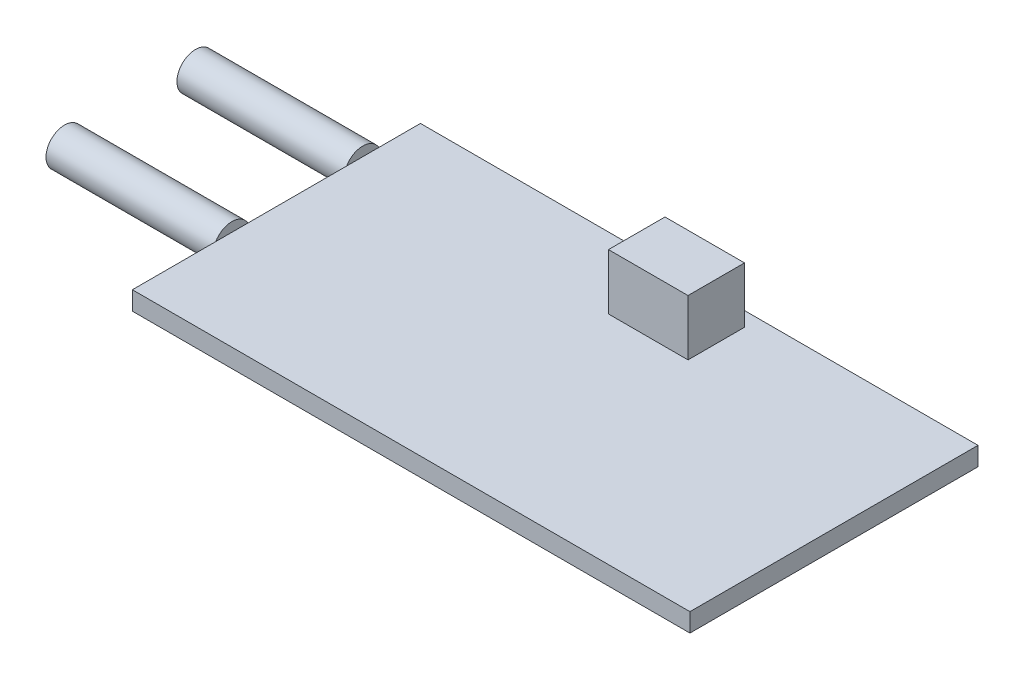
ISO-10303-21;
HEADER;
FILE_DESCRIPTION(('STEP AP214'),'2;1');
FILE_NAME('part.step','',(''),(''),'','','');
FILE_SCHEMA(('AUTOMOTIVE_DESIGN { 1 0 10303 214 1 1 1 1 }'));
ENDSEC;
DATA;
#1=APPLICATION_CONTEXT('core data for automotive mechanical design processes');
#2=APPLICATION_PROTOCOL_DEFINITION('international standard','automotive_design',2000,#1);
#3=PRODUCT_CONTEXT('',#1,'mechanical');
#4=PRODUCT('Part','Part','',(#3));
#5=PRODUCT_RELATED_PRODUCT_CATEGORY('part','',(#4));
#6=PRODUCT_DEFINITION_FORMATION('','',#4);
#7=PRODUCT_DEFINITION_CONTEXT('part definition',#1,'design');
#8=PRODUCT_DEFINITION('design','',#6,#7);
#9=PRODUCT_DEFINITION_SHAPE('','',#8);
#10=(LENGTH_UNIT() NAMED_UNIT(*) SI_UNIT(.MILLI.,.METRE.));
#11=(NAMED_UNIT(*) PLANE_ANGLE_UNIT() SI_UNIT($,.RADIAN.));
#12=(NAMED_UNIT(*) SI_UNIT($,.STERADIAN.) SOLID_ANGLE_UNIT());
#13=UNCERTAINTY_MEASURE_WITH_UNIT(LENGTH_MEASURE(1.E-05),#10,'distance_accuracy_value','');
#14=(GEOMETRIC_REPRESENTATION_CONTEXT(3) GLOBAL_UNCERTAINTY_ASSIGNED_CONTEXT((#13)) GLOBAL_UNIT_ASSIGNED_CONTEXT((#10,
#11,#12)) REPRESENTATION_CONTEXT('',''));
#15=CARTESIAN_POINT('',(0.,0.,0.));
#16=DIRECTION('',(0.,0.,1.));
#17=DIRECTION('',(1.,0.,0.));
#18=AXIS2_PLACEMENT_3D('',#15,#16,#17);
#19=CARTESIAN_POINT('',(0.,1.,0.));
#20=DIRECTION('',(0.,1.,0.));
#21=DIRECTION('',(0.,0.,1.));
#22=AXIS2_PLACEMENT_3D('',#19,#20,#21);
#23=PLANE('',#22);
#24=DIRECTION('',(0.,0.,1.));
#25=VECTOR('',#24,1.);
#26=CARTESIAN_POINT('',(-13.2565925385268,1.,-3.82128101443198));
#27=LINE('',#26,#25);
#28=CARTESIAN_POINT('',(-13.2565925385268,1.,-3.82128101443198));
#29=VERTEX_POINT('',#28);
#30=CARTESIAN_POINT('',(-13.2565925385268,1.,-1.58380192241857));
#31=VERTEX_POINT('',#30);
#32=EDGE_CURVE('E172',#29,#31,#27,.T.);
#33=ORIENTED_EDGE('',*,*,#32,.T.);
#34=CARTESIAN_POINT('',(-13.2565925385268,1.,0.148248885150303));
#35=VERTEX_POINT('',#34);
#36=EDGE_CURVE('E176',#31,#35,#27,.T.);
#37=ORIENTED_EDGE('',*,*,#36,.T.);
#38=CARTESIAN_POINT('',(-13.2565925385268,1.,5.46048365552543));
#39=VERTEX_POINT('',#38);
#40=EDGE_CURVE('E221',#35,#39,#27,.T.);
#41=ORIENTED_EDGE('',*,*,#40,.T.);
#42=DIRECTION('',(0.,0.,1.));
#43=VECTOR('',#42,1.);
#44=CARTESIAN_POINT('',(-13.2565925385268,1.,0.));
#45=LINE('',#44,#43);
#46=CARTESIAN_POINT('',(-13.2565925385268,1.,7.19253446309431));
#47=VERTEX_POINT('',#46);
#48=EDGE_CURVE('E161',#39,#47,#45,.T.);
#49=ORIENTED_EDGE('',*,*,#48,.T.);
#50=CARTESIAN_POINT('',(-13.2565925385268,1.,11.678718985568));
#51=VERTEX_POINT('',#50);
#52=EDGE_CURVE('E58',#47,#51,#27,.T.);
#53=ORIENTED_EDGE('',*,*,#52,.T.);
#54=DIRECTION('',(1.,0.,0.));
#55=VECTOR('',#54,1.);
#56=CARTESIAN_POINT('',(-13.2565925385268,1.,11.678718985568));
#57=LINE('',#56,#55);
#58=CARTESIAN_POINT('',(16.7434074614732,1.,11.678718985568));
#59=VERTEX_POINT('',#58);
#60=EDGE_CURVE('E175',#51,#59,#57,.T.);
#61=ORIENTED_EDGE('',*,*,#60,.T.);
#62=DIRECTION('',(0.,0.,-1.));
#63=VECTOR('',#62,1.);
#64=CARTESIAN_POINT('',(16.7434074614732,1.,-3.82128101443198));
#65=LINE('',#64,#63);
#66=CARTESIAN_POINT('',(16.7434074614732,1.,-3.82128101443198));
#67=VERTEX_POINT('',#66);
#68=EDGE_CURVE('E178',#59,#67,#65,.T.);
#69=ORIENTED_EDGE('',*,*,#68,.T.);
#70=DIRECTION('',(-1.,0.,0.));
#71=VECTOR('',#70,1.);
#72=CARTESIAN_POINT('',(-13.2565925385268,1.,-3.82128101443198));
#73=LINE('',#72,#71);
#74=EDGE_CURVE('E180',#67,#29,#73,.T.);
#75=ORIENTED_EDGE('',*,*,#74,.T.);
#76=EDGE_LOOP('',(#33,#37,#41,#49,#53,#61,#69,#75));
#77=FACE_BOUND('',#76,.T.);
#78=DIRECTION('',(1.,0.,0.));
#79=VECTOR('',#78,1.);
#80=CARTESIAN_POINT('',(0.681732786404154,1.,0.));
#81=LINE('',#80,#79);
#82=CARTESIAN_POINT('',(0.681732786404154,1.,0.));
#83=VERTEX_POINT('',#82);
#84=CARTESIAN_POINT('',(4.96113015813648,1.,0.));
#85=VERTEX_POINT('',#84);
#86=EDGE_CURVE('E433',#83,#85,#81,.T.);
#87=ORIENTED_EDGE('',*,*,#86,.F.);
#88=DIRECTION('',(0.,0.,1.));
#89=VECTOR('',#88,1.);
#90=CARTESIAN_POINT('',(0.681732786404154,1.,-3.04077300840788));
#91=LINE('',#90,#89);
#92=CARTESIAN_POINT('',(0.681732786404154,1.,-3.04077300840788));
#93=VERTEX_POINT('',#92);
#94=EDGE_CURVE('E148',#93,#83,#91,.T.);
#95=ORIENTED_EDGE('',*,*,#94,.F.);
#96=DIRECTION('',(-1.,0.,0.));
#97=VECTOR('',#96,1.);
#98=CARTESIAN_POINT('',(0.681732786404154,1.,-3.04077300840788));
#99=LINE('',#98,#97);
#100=CARTESIAN_POINT('',(4.96113015813648,1.,-3.04077300840788));
#101=VERTEX_POINT('',#100);
#102=EDGE_CURVE('E144',#101,#93,#99,.T.);
#103=ORIENTED_EDGE('',*,*,#102,.F.);
#104=DIRECTION('',(0.,0.,-1.));
#105=VECTOR('',#104,1.);
#106=CARTESIAN_POINT('',(4.96113015813648,1.,-3.04077300840788));
#107=LINE('',#106,#105);
#108=EDGE_CURVE('E430',#85,#101,#107,.T.);
#109=ORIENTED_EDGE('',*,*,#108,.F.);
#110=EDGE_LOOP('',(#87,#95,#103,#109));
#111=FACE_BOUND('',#110,.T.);
#112=ADVANCED_FACE('F32',(#77,#111),#23,.T.);
#113=CARTESIAN_POINT('',(-13.2565925385268,1.,-3.82128101443198));
#114=DIRECTION('',(1.,0.,0.));
#115=DIRECTION('',(0.,0.,-1.));
#116=AXIS2_PLACEMENT_3D('',#113,#114,#115);
#117=PLANE('',#116);
#118=CARTESIAN_POINT('',(-13.2565925385268,0.5,6.32650905930987));
#119=DIRECTION('',(-1.,0.,0.));
#120=DIRECTION('',(0.,0.,1.));
#121=AXIS2_PLACEMENT_3D('',#118,#119,#120);
#122=CIRCLE('',#121,1.);
#123=CARTESIAN_POINT('',(-13.2565925385268,0.,7.19253446309431));
#124=VERTEX_POINT('',#123);
#125=EDGE_CURVE('E150',#124,#47,#122,.T.);
#126=ORIENTED_EDGE('',*,*,#125,.F.);
#127=DIRECTION('',(0.,0.,1.));
#128=VECTOR('',#127,1.);
#129=CARTESIAN_POINT('',(-13.2565925385268,0.,-3.82128101443198));
#130=LINE('',#129,#128);
#131=CARTESIAN_POINT('',(-13.2565925385268,0.,11.678718985568));
#132=VERTEX_POINT('',#131);
#133=EDGE_CURVE('E168',#124,#132,#130,.T.);
#134=ORIENTED_EDGE('',*,*,#133,.T.);
#135=DIRECTION('',(0.,-1.,0.));
#136=VECTOR('',#135,1.);
#137=CARTESIAN_POINT('',(-13.2565925385268,1.,11.678718985568));
#138=LINE('',#137,#136);
#139=EDGE_CURVE('E36',#51,#132,#138,.T.);
#140=ORIENTED_EDGE('',*,*,#139,.F.);
#141=ORIENTED_EDGE('',*,*,#52,.F.);
#142=EDGE_LOOP('',(#126,#134,#140,#141));
#143=FACE_BOUND('',#142,.T.);
#144=ADVANCED_FACE('F225',(#143),#117,.F.);
#145=CARTESIAN_POINT('',(-13.2565925385268,0.5,-0.717776518634136));
#146=DIRECTION('',(-1.,0.,0.));
#147=DIRECTION('',(0.,0.,1.));
#148=AXIS2_PLACEMENT_3D('',#145,#146,#147);
#149=CIRCLE('',#148,1.);
#150=CARTESIAN_POINT('',(-13.2565925385268,0.,-1.58380192241857));
#151=VERTEX_POINT('',#150);
#152=EDGE_CURVE('E11',#31,#151,#149,.T.);
#153=ORIENTED_EDGE('',*,*,#152,.F.);
#154=ORIENTED_EDGE('',*,*,#32,.F.);
#155=DIRECTION('',(0.,-1.,0.));
#156=VECTOR('',#155,1.);
#157=CARTESIAN_POINT('',(-13.2565925385268,1.,-3.82128101443198));
#158=LINE('',#157,#156);
#159=CARTESIAN_POINT('',(-13.2565925385268,0.,-3.82128101443198));
#160=VERTEX_POINT('',#159);
#161=EDGE_CURVE('E182',#29,#160,#158,.T.);
#162=ORIENTED_EDGE('',*,*,#161,.T.);
#163=EDGE_CURVE('E183',#160,#151,#130,.T.);
#164=ORIENTED_EDGE('',*,*,#163,.T.);
#165=EDGE_LOOP('',(#153,#154,#162,#164));
#166=FACE_BOUND('',#165,.T.);
#167=ADVANCED_FACE('F241',(#166),#117,.F.);
#168=CARTESIAN_POINT('',(-13.2565925385268,0.,5.46048365552543));
#169=VERTEX_POINT('',#168);
#170=EDGE_CURVE('E164',#39,#169,#122,.T.);
#171=ORIENTED_EDGE('',*,*,#170,.F.);
#172=ORIENTED_EDGE('',*,*,#40,.F.);
#173=CARTESIAN_POINT('',(-13.2565925385268,0.,0.148248885150303));
#174=VERTEX_POINT('',#173);
#175=EDGE_CURVE('E41',#174,#35,#149,.T.);
#176=ORIENTED_EDGE('',*,*,#175,.F.);
#177=EDGE_CURVE('E245',#174,#169,#130,.T.);
#178=ORIENTED_EDGE('',*,*,#177,.T.);
#179=EDGE_LOOP('',(#171,#172,#176,#178));
#180=FACE_BOUND('',#179,.T.);
#181=ADVANCED_FACE('F34',(#180),#117,.F.);
#182=CARTESIAN_POINT('',(-13.2565925385268,1.,11.678718985568));
#183=DIRECTION('',(0.,0.,-1.));
#184=DIRECTION('',(-1.,0.,0.));
#185=AXIS2_PLACEMENT_3D('',#182,#183,#184);
#186=PLANE('',#185);
#187=DIRECTION('',(1.,0.,0.));
#188=VECTOR('',#187,1.);
#189=CARTESIAN_POINT('',(-13.2565925385268,0.,11.678718985568));
#190=LINE('',#189,#188);
#191=CARTESIAN_POINT('',(16.7434074614732,0.,11.678718985568));
#192=VERTEX_POINT('',#191);
#193=EDGE_CURVE('E186',#132,#192,#190,.T.);
#194=ORIENTED_EDGE('',*,*,#193,.T.);
#195=DIRECTION('',(0.,-1.,0.));
#196=VECTOR('',#195,1.);
#197=CARTESIAN_POINT('',(16.7434074614732,1.,11.678718985568));
#198=LINE('',#197,#196);
#199=EDGE_CURVE('E197',#59,#192,#198,.T.);
#200=ORIENTED_EDGE('',*,*,#199,.F.);
#201=ORIENTED_EDGE('',*,*,#60,.F.);
#202=ORIENTED_EDGE('',*,*,#139,.T.);
#203=EDGE_LOOP('',(#194,#200,#201,#202));
#204=FACE_BOUND('',#203,.T.);
#205=ADVANCED_FACE('F224',(#204),#186,.F.);
#206=CARTESIAN_POINT('',(16.7434074614732,1.,-3.82128101443198));
#207=DIRECTION('',(-1.,0.,0.));
#208=DIRECTION('',(0.,0.,1.));
#209=AXIS2_PLACEMENT_3D('',#206,#207,#208);
#210=PLANE('',#209);
#211=DIRECTION('',(0.,0.,-1.));
#212=VECTOR('',#211,1.);
#213=CARTESIAN_POINT('',(16.7434074614732,0.,-3.82128101443198));
#214=LINE('',#213,#212);
#215=CARTESIAN_POINT('',(16.7434074614732,0.,-3.82128101443198));
#216=VERTEX_POINT('',#215);
#217=EDGE_CURVE('E189',#192,#216,#214,.T.);
#218=ORIENTED_EDGE('',*,*,#217,.T.);
#219=DIRECTION('',(0.,-1.,0.));
#220=VECTOR('',#219,1.);
#221=CARTESIAN_POINT('',(16.7434074614732,1.,-3.82128101443198));
#222=LINE('',#221,#220);
#223=EDGE_CURVE('E195',#67,#216,#222,.T.);
#224=ORIENTED_EDGE('',*,*,#223,.F.);
#225=ORIENTED_EDGE('',*,*,#68,.F.);
#226=ORIENTED_EDGE('',*,*,#199,.T.);
#227=EDGE_LOOP('',(#218,#224,#225,#226));
#228=FACE_BOUND('',#227,.T.);
#229=ADVANCED_FACE('F234',(#228),#210,.F.);
#230=CARTESIAN_POINT('',(-13.2565925385268,1.,-3.82128101443198));
#231=DIRECTION('',(0.,0.,1.));
#232=DIRECTION('',(1.,0.,0.));
#233=AXIS2_PLACEMENT_3D('',#230,#231,#232);
#234=PLANE('',#233);
#235=DIRECTION('',(-1.,0.,0.));
#236=VECTOR('',#235,1.);
#237=CARTESIAN_POINT('',(-13.2565925385268,0.,-3.82128101443198));
#238=LINE('',#237,#236);
#239=EDGE_CURVE('E191',#216,#160,#238,.T.);
#240=ORIENTED_EDGE('',*,*,#239,.T.);
#241=ORIENTED_EDGE('',*,*,#161,.F.);
#242=ORIENTED_EDGE('',*,*,#74,.F.);
#243=ORIENTED_EDGE('',*,*,#223,.T.);
#244=EDGE_LOOP('',(#240,#241,#242,#243));
#245=FACE_BOUND('',#244,.T.);
#246=ADVANCED_FACE('F237',(#245),#234,.F.);
#247=CARTESIAN_POINT('',(0.,0.,0.));
#248=DIRECTION('',(0.,1.,0.));
#249=DIRECTION('',(0.,0.,1.));
#250=AXIS2_PLACEMENT_3D('',#247,#248,#249);
#251=PLANE('',#250);
#252=ORIENTED_EDGE('',*,*,#163,.F.);
#253=ORIENTED_EDGE('',*,*,#239,.F.);
#254=ORIENTED_EDGE('',*,*,#217,.F.);
#255=ORIENTED_EDGE('',*,*,#193,.F.);
#256=ORIENTED_EDGE('',*,*,#133,.F.);
#257=EDGE_CURVE('E229',#169,#124,#130,.T.);
#258=ORIENTED_EDGE('',*,*,#257,.F.);
#259=ORIENTED_EDGE('',*,*,#177,.F.);
#260=EDGE_CURVE('E187',#151,#174,#130,.T.);
#261=ORIENTED_EDGE('',*,*,#260,.F.);
#262=EDGE_LOOP('',(#252,#253,#254,#255,#256,#258,#259,#261));
#263=FACE_BOUND('',#262,.T.);
#264=ADVANCED_FACE('F231',(#263),#251,.F.);
#265=CARTESIAN_POINT('',(-13.2565925385268,0.5,-0.717776518634136));
#266=DIRECTION('',(-1.,0.,0.));
#267=DIRECTION('',(0.,0.,1.));
#268=AXIS2_PLACEMENT_3D('',#265,#266,#267);
#269=PLANE('',#268);
#270=EDGE_CURVE('E43',#151,#174,#149,.T.);
#271=ORIENTED_EDGE('',*,*,#270,.F.);
#272=ORIENTED_EDGE('',*,*,#260,.T.);
#273=EDGE_LOOP('',(#271,#272));
#274=FACE_BOUND('',#273,.T.);
#275=ADVANCED_FACE('F244',(#274),#269,.F.);
#276=CARTESIAN_POINT('',(-22.2565925385268,0.5,-0.717776518634134));
#277=DIRECTION('',(1.,0.,0.));
#278=DIRECTION('',(0.,0.,-1.));
#279=AXIS2_PLACEMENT_3D('',#276,#277,#278);
#280=CYLINDRICAL_SURFACE('',#279,1.);
#281=CARTESIAN_POINT('',(-22.2565925385268,0.5,-0.717776518634134));
#282=DIRECTION('',(-1.,0.,0.));
#283=DIRECTION('',(0.,0.,1.));
#284=AXIS2_PLACEMENT_3D('',#281,#282,#283);
#285=CIRCLE('',#284,1.);
#286=CARTESIAN_POINT('',(-22.2565925385268,0.5,0.282223481365866));
#287=VERTEX_POINT('',#286);
#288=EDGE_CURVE('E166',#287,#287,#285,.T.);
#289=ORIENTED_EDGE('',*,*,#288,.F.);
#290=EDGE_LOOP('',(#289));
#291=FACE_BOUND('',#290,.T.);
#292=EDGE_CURVE('E169',#35,#31,#149,.T.);
#293=ORIENTED_EDGE('',*,*,#292,.T.);
#294=ORIENTED_EDGE('',*,*,#152,.T.);
#295=ORIENTED_EDGE('',*,*,#270,.T.);
#296=ORIENTED_EDGE('',*,*,#175,.T.);
#297=EDGE_LOOP('',(#293,#294,#295,#296));
#298=FACE_BOUND('',#297,.T.);
#299=ADVANCED_FACE('F210',(#291,#298),#280,.T.);
#300=CARTESIAN_POINT('',(-22.2565925385268,0.5,-0.717776518634134));
#301=DIRECTION('',(-1.,0.,0.));
#302=DIRECTION('',(0.,0.,1.));
#303=AXIS2_PLACEMENT_3D('',#300,#301,#302);
#304=PLANE('',#303);
#305=ORIENTED_EDGE('',*,*,#288,.T.);
#306=EDGE_LOOP('',(#305));
#307=FACE_BOUND('',#306,.T.);
#308=ADVANCED_FACE('F296',(#307),#304,.T.);
#309=ORIENTED_EDGE('',*,*,#36,.F.);
#310=ORIENTED_EDGE('',*,*,#292,.F.);
#311=EDGE_LOOP('',(#309,#310));
#312=FACE_BOUND('',#311,.T.);
#313=ADVANCED_FACE('F218',(#312),#269,.F.);
#314=CARTESIAN_POINT('',(-13.2565925385268,0.5,6.32650905930987));
#315=DIRECTION('',(-1.,0.,0.));
#316=DIRECTION('',(0.,0.,1.));
#317=AXIS2_PLACEMENT_3D('',#314,#315,#316);
#318=PLANE('',#317);
#319=EDGE_CURVE('E153',#169,#124,#122,.T.);
#320=ORIENTED_EDGE('',*,*,#319,.F.);
#321=ORIENTED_EDGE('',*,*,#257,.T.);
#322=EDGE_LOOP('',(#320,#321));
#323=FACE_BOUND('',#322,.T.);
#324=ADVANCED_FACE('F249',(#323),#318,.F.);
#325=CARTESIAN_POINT('',(-22.2565925385268,0.5,6.32650905930987));
#326=DIRECTION('',(1.,0.,0.));
#327=DIRECTION('',(0.,0.,-1.));
#328=AXIS2_PLACEMENT_3D('',#325,#326,#327);
#329=CYLINDRICAL_SURFACE('',#328,1.);
#330=CARTESIAN_POINT('',(-22.2565925385268,0.5,6.32650905930987));
#331=DIRECTION('',(-1.,0.,0.));
#332=DIRECTION('',(0.,0.,1.));
#333=AXIS2_PLACEMENT_3D('',#330,#331,#332);
#334=CIRCLE('',#333,1.);
#335=CARTESIAN_POINT('',(-22.2565925385268,0.5,7.32650905930987));
#336=VERTEX_POINT('',#335);
#337=EDGE_CURVE('E159',#336,#336,#334,.T.);
#338=ORIENTED_EDGE('',*,*,#337,.F.);
#339=EDGE_LOOP('',(#338));
#340=FACE_BOUND('',#339,.T.);
#341=EDGE_CURVE('E155',#47,#39,#122,.T.);
#342=ORIENTED_EDGE('',*,*,#341,.T.);
#343=ORIENTED_EDGE('',*,*,#170,.T.);
#344=ORIENTED_EDGE('',*,*,#319,.T.);
#345=ORIENTED_EDGE('',*,*,#125,.T.);
#346=EDGE_LOOP('',(#342,#343,#344,#345));
#347=FACE_BOUND('',#346,.T.);
#348=ADVANCED_FACE('F252',(#340,#347),#329,.T.);
#349=CARTESIAN_POINT('',(-22.2565925385268,0.5,6.32650905930987));
#350=DIRECTION('',(-1.,0.,0.));
#351=DIRECTION('',(0.,0.,1.));
#352=AXIS2_PLACEMENT_3D('',#349,#350,#351);
#353=PLANE('',#352);
#354=ORIENTED_EDGE('',*,*,#337,.T.);
#355=EDGE_LOOP('',(#354));
#356=FACE_BOUND('',#355,.T.);
#357=ADVANCED_FACE('F322',(#356),#353,.T.);
#358=ORIENTED_EDGE('',*,*,#48,.F.);
#359=ORIENTED_EDGE('',*,*,#341,.F.);
#360=EDGE_LOOP('',(#358,#359));
#361=FACE_BOUND('',#360,.T.);
#362=ADVANCED_FACE('F316',(#361),#318,.F.);
#363=CARTESIAN_POINT('',(0.681732786404154,4.,-3.04077300840788));
#364=DIRECTION('',(1.,0.,0.));
#365=DIRECTION('',(0.,0.,-1.));
#366=AXIS2_PLACEMENT_3D('',#363,#364,#365);
#367=PLANE('',#366);
#368=ORIENTED_EDGE('',*,*,#94,.T.);
#369=DIRECTION('',(0.,-1.,0.));
#370=VECTOR('',#369,1.);
#371=CARTESIAN_POINT('',(0.681732786404154,4.,0.));
#372=LINE('',#371,#370);
#373=CARTESIAN_POINT('',(0.681732786404154,4.,0.));
#374=VERTEX_POINT('',#373);
#375=EDGE_CURVE('E129',#374,#83,#372,.T.);
#376=ORIENTED_EDGE('',*,*,#375,.F.);
#377=DIRECTION('',(0.,0.,1.));
#378=VECTOR('',#377,1.);
#379=CARTESIAN_POINT('',(0.681732786404154,4.,-3.04077300840788));
#380=LINE('',#379,#378);
#381=CARTESIAN_POINT('',(0.681732786404154,4.,-3.04077300840788));
#382=VERTEX_POINT('',#381);
#383=EDGE_CURVE('E136',#382,#374,#380,.T.);
#384=ORIENTED_EDGE('',*,*,#383,.F.);
#385=DIRECTION('',(0.,-1.,0.));
#386=VECTOR('',#385,1.);
#387=CARTESIAN_POINT('',(0.681732786404154,4.,-3.04077300840788));
#388=LINE('',#387,#386);
#389=EDGE_CURVE('E428',#382,#93,#388,.T.);
#390=ORIENTED_EDGE('',*,*,#389,.T.);
#391=EDGE_LOOP('',(#368,#376,#384,#390));
#392=FACE_BOUND('',#391,.T.);
#393=ADVANCED_FACE('F146',(#392),#367,.F.);
#394=CARTESIAN_POINT('',(0.681732786404154,4.,0.));
#395=DIRECTION('',(0.,0.,-1.));
#396=DIRECTION('',(-1.,0.,0.));
#397=AXIS2_PLACEMENT_3D('',#394,#395,#396);
#398=PLANE('',#397);
#399=ORIENTED_EDGE('',*,*,#86,.T.);
#400=DIRECTION('',(0.,-1.,0.));
#401=VECTOR('',#400,1.);
#402=CARTESIAN_POINT('',(4.96113015813648,4.,0.));
#403=LINE('',#402,#401);
#404=CARTESIAN_POINT('',(4.96113015813648,4.,0.));
#405=VERTEX_POINT('',#404);
#406=EDGE_CURVE('E132',#405,#85,#403,.T.);
#407=ORIENTED_EDGE('',*,*,#406,.F.);
#408=DIRECTION('',(1.,0.,0.));
#409=VECTOR('',#408,1.);
#410=CARTESIAN_POINT('',(0.681732786404154,4.,0.));
#411=LINE('',#410,#409);
#412=EDGE_CURVE('E125',#374,#405,#411,.T.);
#413=ORIENTED_EDGE('',*,*,#412,.F.);
#414=ORIENTED_EDGE('',*,*,#375,.T.);
#415=EDGE_LOOP('',(#399,#407,#413,#414));
#416=FACE_BOUND('',#415,.T.);
#417=ADVANCED_FACE('F127',(#416),#398,.F.);
#418=CARTESIAN_POINT('',(4.96113015813648,4.,-3.04077300840788));
#419=DIRECTION('',(-1.,0.,0.));
#420=DIRECTION('',(0.,0.,1.));
#421=AXIS2_PLACEMENT_3D('',#418,#419,#420);
#422=PLANE('',#421);
#423=ORIENTED_EDGE('',*,*,#108,.T.);
#424=DIRECTION('',(0.,-1.,0.));
#425=VECTOR('',#424,1.);
#426=CARTESIAN_POINT('',(4.96113015813648,4.,-3.04077300840788));
#427=LINE('',#426,#425);
#428=CARTESIAN_POINT('',(4.96113015813648,4.,-3.04077300840788));
#429=VERTEX_POINT('',#428);
#430=EDGE_CURVE('E50',#429,#101,#427,.T.);
#431=ORIENTED_EDGE('',*,*,#430,.F.);
#432=DIRECTION('',(0.,0.,-1.));
#433=VECTOR('',#432,1.);
#434=CARTESIAN_POINT('',(4.96113015813648,4.,-3.04077300840788));
#435=LINE('',#434,#433);
#436=EDGE_CURVE('E135',#405,#429,#435,.T.);
#437=ORIENTED_EDGE('',*,*,#436,.F.);
#438=ORIENTED_EDGE('',*,*,#406,.T.);
#439=EDGE_LOOP('',(#423,#431,#437,#438));
#440=FACE_BOUND('',#439,.T.);
#441=ADVANCED_FACE('F349',(#440),#422,.F.);
#442=CARTESIAN_POINT('',(0.681732786404154,4.,-3.04077300840788));
#443=DIRECTION('',(0.,0.,1.));
#444=DIRECTION('',(1.,0.,0.));
#445=AXIS2_PLACEMENT_3D('',#442,#443,#444);
#446=PLANE('',#445);
#447=ORIENTED_EDGE('',*,*,#102,.T.);
#448=ORIENTED_EDGE('',*,*,#389,.F.);
#449=DIRECTION('',(-1.,0.,0.));
#450=VECTOR('',#449,1.);
#451=CARTESIAN_POINT('',(0.681732786404154,4.,-3.04077300840788));
#452=LINE('',#451,#450);
#453=EDGE_CURVE('E140',#429,#382,#452,.T.);
#454=ORIENTED_EDGE('',*,*,#453,.F.);
#455=ORIENTED_EDGE('',*,*,#430,.T.);
#456=EDGE_LOOP('',(#447,#448,#454,#455));
#457=FACE_BOUND('',#456,.T.);
#458=ADVANCED_FACE('F356',(#457),#446,.F.);
#459=CARTESIAN_POINT('',(0.,4.,0.));
#460=DIRECTION('',(0.,1.,0.));
#461=DIRECTION('',(0.,0.,1.));
#462=AXIS2_PLACEMENT_3D('',#459,#460,#461);
#463=PLANE('',#462);
#464=ORIENTED_EDGE('',*,*,#383,.T.);
#465=ORIENTED_EDGE('',*,*,#412,.T.);
#466=ORIENTED_EDGE('',*,*,#436,.T.);
#467=ORIENTED_EDGE('',*,*,#453,.T.);
#468=EDGE_LOOP('',(#464,#465,#466,#467));
#469=FACE_BOUND('',#468,.T.);
#470=ADVANCED_FACE('F139',(#469),#463,.T.);
#471=CLOSED_SHELL('',(#112,#144,#167,#181,#205,#229,#246,#264,#275,#299,#308,#313,#324,#348,
#357,#362,#393,#417,#441,#458,#470));
#472=MANIFOLD_SOLID_BREP('B2',#471);
#473=ADVANCED_BREP_SHAPE_REPRESENTATION('',(#18,#472),#14);
#474=SHAPE_DEFINITION_REPRESENTATION(#9,#473);
ENDSEC;
END-ISO-10303-21;
